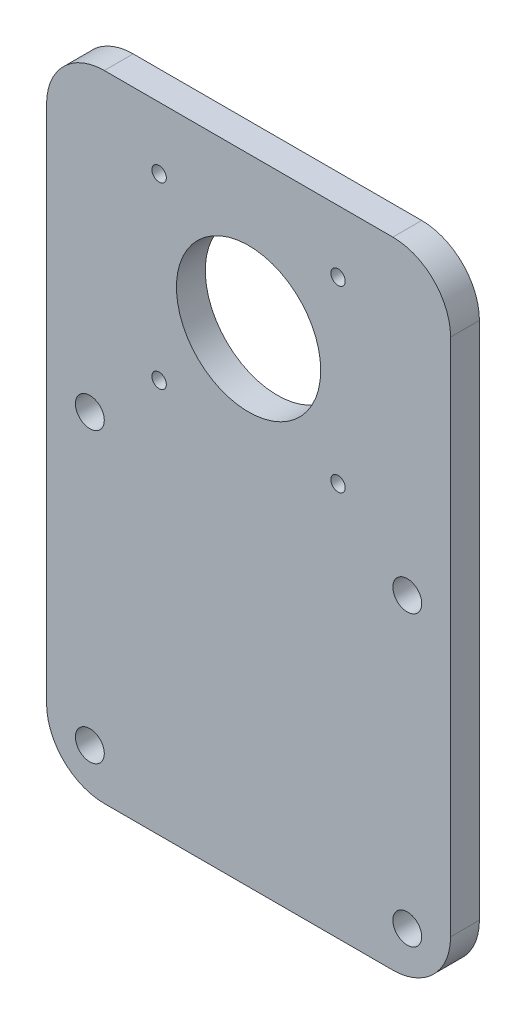
ISO-10303-21;
HEADER;
FILE_DESCRIPTION(('STEP AP214'),'2;1');
FILE_NAME('part.step','',(''),(''),'','','');
FILE_SCHEMA(('AUTOMOTIVE_DESIGN { 1 0 10303 214 1 1 1 1 }'));
ENDSEC;
DATA;
#1=APPLICATION_CONTEXT('core data for automotive mechanical design processes');
#2=APPLICATION_PROTOCOL_DEFINITION('international standard','automotive_design',2000,#1);
#3=PRODUCT_CONTEXT('',#1,'mechanical');
#4=PRODUCT('Part','Part','',(#3));
#5=PRODUCT_RELATED_PRODUCT_CATEGORY('part','',(#4));
#6=PRODUCT_DEFINITION_FORMATION('','',#4);
#7=PRODUCT_DEFINITION_CONTEXT('part definition',#1,'design');
#8=PRODUCT_DEFINITION('design','',#6,#7);
#9=PRODUCT_DEFINITION_SHAPE('','',#8);
#10=(LENGTH_UNIT() NAMED_UNIT(*) SI_UNIT(.MILLI.,.METRE.));
#11=(NAMED_UNIT(*) PLANE_ANGLE_UNIT() SI_UNIT($,.RADIAN.));
#12=(NAMED_UNIT(*) SI_UNIT($,.STERADIAN.) SOLID_ANGLE_UNIT());
#13=UNCERTAINTY_MEASURE_WITH_UNIT(LENGTH_MEASURE(1.E-05),#10,'distance_accuracy_value','');
#14=(GEOMETRIC_REPRESENTATION_CONTEXT(3) GLOBAL_UNCERTAINTY_ASSIGNED_CONTEXT((#13)) GLOBAL_UNIT_ASSIGNED_CONTEXT((#10,
#11,#12)) REPRESENTATION_CONTEXT('',''));
#15=CARTESIAN_POINT('',(0.,0.,0.));
#16=DIRECTION('',(0.,0.,1.));
#17=DIRECTION('',(1.,0.,0.));
#18=AXIS2_PLACEMENT_3D('',#15,#16,#17);
#19=CARTESIAN_POINT('',(0.,0.,5.));
#20=DIRECTION('',(0.,0.,1.));
#21=DIRECTION('',(1.,0.,0.));
#22=AXIS2_PLACEMENT_3D('',#19,#20,#21);
#23=PLANE('',#22);
#24=CARTESIAN_POINT('',(-5.50752462852537,-9.09687212660662,5.));
#25=DIRECTION('',(0.,0.,1.));
#26=DIRECTION('',(1.,0.,0.));
#27=AXIS2_PLACEMENT_3D('',#24,#25,#26);
#28=CIRCLE('',#27,1.25);
#29=CARTESIAN_POINT('',(-4.25752462852537,-9.09687212660662,5.));
#30=VERTEX_POINT('',#29);
#31=EDGE_CURVE('E247',#30,#30,#28,.T.);
#32=ORIENTED_EDGE('',*,*,#31,.F.);
#33=EDGE_LOOP('',(#32));
#34=FACE_BOUND('',#33,.T.);
#35=CARTESIAN_POINT('',(-36.5075246285254,21.9085783709457,5.));
#36=DIRECTION('',(0.,0.,1.));
#37=DIRECTION('',(1.,0.,0.));
#38=AXIS2_PLACEMENT_3D('',#35,#36,#37);
#39=CIRCLE('',#38,1.25);
#40=CARTESIAN_POINT('',(-35.2575246285254,21.9085783709457,5.));
#41=VERTEX_POINT('',#40);
#42=EDGE_CURVE('E231',#41,#41,#39,.T.);
#43=ORIENTED_EDGE('',*,*,#42,.F.);
#44=EDGE_LOOP('',(#43));
#45=FACE_BOUND('',#44,.T.);
#46=CARTESIAN_POINT('',(6.49247537147465,-69.8441468778305,5.));
#47=DIRECTION('',(0.,0.,1.));
#48=DIRECTION('',(1.,0.,0.));
#49=AXIS2_PLACEMENT_3D('',#46,#47,#48);
#50=CIRCLE('',#49,2.5);
#51=CARTESIAN_POINT('',(8.99247537147465,-69.8441468778305,5.));
#52=VERTEX_POINT('',#51);
#53=EDGE_CURVE('E215',#52,#52,#50,.T.);
#54=ORIENTED_EDGE('',*,*,#53,.F.);
#55=EDGE_LOOP('',(#54));
#56=FACE_BOUND('',#55,.T.);
#57=CARTESIAN_POINT('',(6.49247537147464,-19.8441468778305,5.));
#58=DIRECTION('',(0.,0.,1.));
#59=DIRECTION('',(1.,0.,0.));
#60=AXIS2_PLACEMENT_3D('',#57,#58,#59);
#61=CIRCLE('',#60,2.5);
#62=CARTESIAN_POINT('',(8.99247537147464,-19.8441468778305,5.));
#63=VERTEX_POINT('',#62);
#64=EDGE_CURVE('E199',#63,#63,#61,.T.);
#65=ORIENTED_EDGE('',*,*,#64,.F.);
#66=EDGE_LOOP('',(#65));
#67=FACE_BOUND('',#66,.T.);
#68=DIRECTION('',(0.,-1.,0.));
#69=VECTOR('',#68,1.);
#70=CARTESIAN_POINT('',(-56.0075246285254,32.6558531221695,5.));
#71=LINE('',#70,#69);
#72=CARTESIAN_POINT('',(-56.0075246285254,22.6558531221695,5.));
#73=VERTEX_POINT('',#72);
#74=CARTESIAN_POINT('',(-56.0075246285254,-67.3441468778305,5.));
#75=VERTEX_POINT('',#74);
#76=EDGE_CURVE('E150',#73,#75,#71,.T.);
#77=ORIENTED_EDGE('',*,*,#76,.T.);
#78=CARTESIAN_POINT('',(-46.0075246285254,-67.3441468778305,5.));
#79=DIRECTION('',(0.,0.,1.));
#80=DIRECTION('',(1.,0.,0.));
#81=AXIS2_PLACEMENT_3D('',#78,#79,#80);
#82=CIRCLE('',#81,10.);
#83=CARTESIAN_POINT('',(-46.0075246285254,-77.3441468778305,5.));
#84=VERTEX_POINT('',#83);
#85=EDGE_CURVE('E174',#75,#84,#82,.T.);
#86=ORIENTED_EDGE('',*,*,#85,.T.);
#87=DIRECTION('',(1.,0.,0.));
#88=VECTOR('',#87,1.);
#89=CARTESIAN_POINT('',(-56.0075246285254,-77.3441468778305,5.));
#90=LINE('',#89,#88);
#91=CARTESIAN_POINT('',(3.99247537147465,-77.3441468778305,5.));
#92=VERTEX_POINT('',#91);
#93=EDGE_CURVE('E127',#84,#92,#90,.T.);
#94=ORIENTED_EDGE('',*,*,#93,.T.);
#95=CARTESIAN_POINT('',(3.99247537147465,-67.3441468778305,5.));
#96=DIRECTION('',(0.,0.,1.));
#97=DIRECTION('',(1.,0.,0.));
#98=AXIS2_PLACEMENT_3D('',#95,#96,#97);
#99=CIRCLE('',#98,10.);
#100=CARTESIAN_POINT('',(13.9924753714746,-67.3441468778305,5.));
#101=VERTEX_POINT('',#100);
#102=EDGE_CURVE('E171',#92,#101,#99,.T.);
#103=ORIENTED_EDGE('',*,*,#102,.T.);
#104=DIRECTION('',(0.,1.,0.));
#105=VECTOR('',#104,1.);
#106=CARTESIAN_POINT('',(13.9924753714746,32.6558531221695,5.));
#107=LINE('',#106,#105);
#108=CARTESIAN_POINT('',(13.9924753714746,22.6558531221695,5.));
#109=VERTEX_POINT('',#108);
#110=EDGE_CURVE('E186',#101,#109,#107,.T.);
#111=ORIENTED_EDGE('',*,*,#110,.T.);
#112=CARTESIAN_POINT('',(3.99247537147463,22.6558531221695,5.));
#113=DIRECTION('',(0.,0.,1.));
#114=DIRECTION('',(1.,0.,0.));
#115=AXIS2_PLACEMENT_3D('',#112,#113,#114);
#116=CIRCLE('',#115,10.);
#117=CARTESIAN_POINT('',(3.99247537147463,32.6558531221695,5.));
#118=VERTEX_POINT('',#117);
#119=EDGE_CURVE('E61',#109,#118,#116,.T.);
#120=ORIENTED_EDGE('',*,*,#119,.T.);
#121=DIRECTION('',(-1.,0.,0.));
#122=VECTOR('',#121,1.);
#123=CARTESIAN_POINT('',(-56.0075246285254,32.6558531221695,5.));
#124=LINE('',#123,#122);
#125=CARTESIAN_POINT('',(-46.0075246285254,32.6558531221695,5.));
#126=VERTEX_POINT('',#125);
#127=EDGE_CURVE('E152',#118,#126,#124,.T.);
#128=ORIENTED_EDGE('',*,*,#127,.T.);
#129=CARTESIAN_POINT('',(-46.0075246285254,22.6558531221695,5.));
#130=DIRECTION('',(0.,0.,1.));
#131=DIRECTION('',(1.,0.,0.));
#132=AXIS2_PLACEMENT_3D('',#129,#130,#131);
#133=CIRCLE('',#132,10.);
#134=EDGE_CURVE('E166',#126,#73,#133,.T.);
#135=ORIENTED_EDGE('',*,*,#134,.T.);
#136=EDGE_LOOP('',(#77,#86,#94,#103,#111,#120,#128,#135));
#137=FACE_BOUND('',#136,.T.);
#138=CARTESIAN_POINT('',(-48.5075246285254,-19.8441468778305,5.));
#139=DIRECTION('',(0.,0.,1.));
#140=DIRECTION('',(1.,0.,0.));
#141=AXIS2_PLACEMENT_3D('',#138,#139,#140);
#142=CIRCLE('',#141,2.5);
#143=CARTESIAN_POINT('',(-46.0075246285254,-19.8441468778305,5.));
#144=VERTEX_POINT('',#143);
#145=EDGE_CURVE('E144',#144,#144,#142,.T.);
#146=ORIENTED_EDGE('',*,*,#145,.F.);
#147=EDGE_LOOP('',(#146));
#148=FACE_BOUND('',#147,.T.);
#149=CARTESIAN_POINT('',(-48.5075246285254,-69.8441468778305,5.));
#150=DIRECTION('',(0.,0.,1.));
#151=DIRECTION('',(1.,0.,0.));
#152=AXIS2_PLACEMENT_3D('',#149,#150,#151);
#153=CIRCLE('',#152,2.5);
#154=CARTESIAN_POINT('',(-46.0075246285254,-69.8441468778305,5.));
#155=VERTEX_POINT('',#154);
#156=EDGE_CURVE('E207',#155,#155,#153,.T.);
#157=ORIENTED_EDGE('',*,*,#156,.F.);
#158=EDGE_LOOP('',(#157));
#159=FACE_BOUND('',#158,.T.);
#160=CARTESIAN_POINT('',(-21.0075246285254,6.40585312216952,5.));
#161=DIRECTION('',(0.,0.,1.));
#162=DIRECTION('',(1.,0.,0.));
#163=AXIS2_PLACEMENT_3D('',#160,#161,#162);
#164=CIRCLE('',#163,12.5);
#165=CARTESIAN_POINT('',(-8.50752462852537,6.40585312216952,5.));
#166=VERTEX_POINT('',#165);
#167=EDGE_CURVE('E223',#166,#166,#164,.T.);
#168=ORIENTED_EDGE('',*,*,#167,.F.);
#169=EDGE_LOOP('',(#168));
#170=FACE_BOUND('',#169,.T.);
#171=CARTESIAN_POINT('',(-5.50752462852537,21.9031283524692,5.));
#172=DIRECTION('',(0.,0.,1.));
#173=DIRECTION('',(1.,0.,0.));
#174=AXIS2_PLACEMENT_3D('',#171,#172,#173);
#175=CIRCLE('',#174,1.25);
#176=CARTESIAN_POINT('',(-4.25752462852537,21.9031283524692,5.));
#177=VERTEX_POINT('',#176);
#178=EDGE_CURVE('E239',#177,#177,#175,.T.);
#179=ORIENTED_EDGE('',*,*,#178,.F.);
#180=EDGE_LOOP('',(#179));
#181=FACE_BOUND('',#180,.T.);
#182=CARTESIAN_POINT('',(-36.5075246285254,-9.09142210813016,5.));
#183=DIRECTION('',(0.,0.,1.));
#184=DIRECTION('',(1.,0.,0.));
#185=AXIS2_PLACEMENT_3D('',#182,#183,#184);
#186=CIRCLE('',#185,1.25);
#187=CARTESIAN_POINT('',(-35.2575246285254,-9.09142210813016,5.));
#188=VERTEX_POINT('',#187);
#189=EDGE_CURVE('E255',#188,#188,#186,.T.);
#190=ORIENTED_EDGE('',*,*,#189,.F.);
#191=EDGE_LOOP('',(#190));
#192=FACE_BOUND('',#191,.T.);
#193=ADVANCED_FACE('F39',(#34,#45,#56,#67,#137,#148,#159,#170,#181,#192),#23,.T.);
#194=CARTESIAN_POINT('',(0.,0.,0.));
#195=DIRECTION('',(0.,0.,1.));
#196=DIRECTION('',(1.,0.,0.));
#197=AXIS2_PLACEMENT_3D('',#194,#195,#196);
#198=PLANE('',#197);
#199=DIRECTION('',(1.,0.,0.));
#200=VECTOR('',#199,1.);
#201=CARTESIAN_POINT('',(-56.0075246285254,-77.3441468778305,0.));
#202=LINE('',#201,#200);
#203=CARTESIAN_POINT('',(-46.0075246285254,-77.3441468778305,0.));
#204=VERTEX_POINT('',#203);
#205=CARTESIAN_POINT('',(3.99247537147465,-77.3441468778305,0.));
#206=VERTEX_POINT('',#205);
#207=EDGE_CURVE('E124',#204,#206,#202,.T.);
#208=ORIENTED_EDGE('',*,*,#207,.F.);
#209=CARTESIAN_POINT('',(-46.0075246285254,-67.3441468778305,0.));
#210=DIRECTION('',(0.,0.,1.));
#211=DIRECTION('',(1.,0.,0.));
#212=AXIS2_PLACEMENT_3D('',#209,#210,#211);
#213=CIRCLE('',#212,10.);
#214=CARTESIAN_POINT('',(-56.0075246285254,-67.3441468778305,0.));
#215=VERTEX_POINT('',#214);
#216=EDGE_CURVE('E106',#204,#215,#213,.F.);
#217=ORIENTED_EDGE('',*,*,#216,.T.);
#218=DIRECTION('',(0.,-1.,0.));
#219=VECTOR('',#218,1.);
#220=CARTESIAN_POINT('',(-56.0075246285254,32.6558531221695,0.));
#221=LINE('',#220,#219);
#222=CARTESIAN_POINT('',(-56.0075246285254,22.6558531221695,0.));
#223=VERTEX_POINT('',#222);
#224=EDGE_CURVE('E137',#223,#215,#221,.T.);
#225=ORIENTED_EDGE('',*,*,#224,.F.);
#226=CARTESIAN_POINT('',(-46.0075246285254,22.6558531221695,0.));
#227=DIRECTION('',(0.,0.,1.));
#228=DIRECTION('',(1.,0.,0.));
#229=AXIS2_PLACEMENT_3D('',#226,#227,#228);
#230=CIRCLE('',#229,10.);
#231=CARTESIAN_POINT('',(-46.0075246285254,32.6558531221695,0.));
#232=VERTEX_POINT('',#231);
#233=EDGE_CURVE('E129',#223,#232,#230,.F.);
#234=ORIENTED_EDGE('',*,*,#233,.T.);
#235=DIRECTION('',(-1.,0.,0.));
#236=VECTOR('',#235,1.);
#237=CARTESIAN_POINT('',(-56.0075246285254,32.6558531221695,0.));
#238=LINE('',#237,#236);
#239=CARTESIAN_POINT('',(3.99247537147463,32.6558531221695,0.));
#240=VERTEX_POINT('',#239);
#241=EDGE_CURVE('E142',#240,#232,#238,.T.);
#242=ORIENTED_EDGE('',*,*,#241,.F.);
#243=CARTESIAN_POINT('',(3.99247537147463,22.6558531221695,0.));
#244=DIRECTION('',(0.,0.,1.));
#245=DIRECTION('',(1.,0.,0.));
#246=AXIS2_PLACEMENT_3D('',#243,#244,#245);
#247=CIRCLE('',#246,10.);
#248=CARTESIAN_POINT('',(13.9924753714746,22.6558531221695,0.));
#249=VERTEX_POINT('',#248);
#250=EDGE_CURVE('E156',#240,#249,#247,.F.);
#251=ORIENTED_EDGE('',*,*,#250,.T.);
#252=DIRECTION('',(0.,1.,0.));
#253=VECTOR('',#252,1.);
#254=CARTESIAN_POINT('',(13.9924753714746,32.6558531221695,0.));
#255=LINE('',#254,#253);
#256=CARTESIAN_POINT('',(13.9924753714746,-67.3441468778305,0.));
#257=VERTEX_POINT('',#256);
#258=EDGE_CURVE('E136',#257,#249,#255,.T.);
#259=ORIENTED_EDGE('',*,*,#258,.F.);
#260=CARTESIAN_POINT('',(3.99247537147465,-67.3441468778305,0.));
#261=DIRECTION('',(0.,0.,1.));
#262=DIRECTION('',(1.,0.,0.));
#263=AXIS2_PLACEMENT_3D('',#260,#261,#262);
#264=CIRCLE('',#263,10.);
#265=EDGE_CURVE('E118',#257,#206,#264,.F.);
#266=ORIENTED_EDGE('',*,*,#265,.T.);
#267=EDGE_LOOP('',(#208,#217,#225,#234,#242,#251,#259,#266));
#268=FACE_BOUND('',#267,.T.);
#269=CARTESIAN_POINT('',(-48.5075246285254,-19.8441468778305,0.));
#270=DIRECTION('',(0.,0.,1.));
#271=DIRECTION('',(1.,0.,0.));
#272=AXIS2_PLACEMENT_3D('',#269,#270,#271);
#273=CIRCLE('',#272,2.5);
#274=CARTESIAN_POINT('',(-46.0075246285254,-19.8441468778305,0.));
#275=VERTEX_POINT('',#274);
#276=EDGE_CURVE('E195',#275,#275,#273,.T.);
#277=ORIENTED_EDGE('',*,*,#276,.T.);
#278=EDGE_LOOP('',(#277));
#279=FACE_BOUND('',#278,.T.);
#280=CARTESIAN_POINT('',(6.49247537147464,-19.8441468778305,0.));
#281=DIRECTION('',(0.,0.,1.));
#282=DIRECTION('',(1.,0.,0.));
#283=AXIS2_PLACEMENT_3D('',#280,#281,#282);
#284=CIRCLE('',#283,2.5);
#285=CARTESIAN_POINT('',(8.99247537147464,-19.8441468778305,0.));
#286=VERTEX_POINT('',#285);
#287=EDGE_CURVE('E203',#286,#286,#284,.T.);
#288=ORIENTED_EDGE('',*,*,#287,.T.);
#289=EDGE_LOOP('',(#288));
#290=FACE_BOUND('',#289,.T.);
#291=CARTESIAN_POINT('',(-48.5075246285254,-69.8441468778305,0.));
#292=DIRECTION('',(0.,0.,1.));
#293=DIRECTION('',(1.,0.,0.));
#294=AXIS2_PLACEMENT_3D('',#291,#292,#293);
#295=CIRCLE('',#294,2.5);
#296=CARTESIAN_POINT('',(-46.0075246285254,-69.8441468778305,0.));
#297=VERTEX_POINT('',#296);
#298=EDGE_CURVE('E211',#297,#297,#295,.T.);
#299=ORIENTED_EDGE('',*,*,#298,.T.);
#300=EDGE_LOOP('',(#299));
#301=FACE_BOUND('',#300,.T.);
#302=CARTESIAN_POINT('',(6.49247537147465,-69.8441468778305,0.));
#303=DIRECTION('',(0.,0.,1.));
#304=DIRECTION('',(1.,0.,0.));
#305=AXIS2_PLACEMENT_3D('',#302,#303,#304);
#306=CIRCLE('',#305,2.5);
#307=CARTESIAN_POINT('',(8.99247537147465,-69.8441468778305,0.));
#308=VERTEX_POINT('',#307);
#309=EDGE_CURVE('E219',#308,#308,#306,.T.);
#310=ORIENTED_EDGE('',*,*,#309,.T.);
#311=EDGE_LOOP('',(#310));
#312=FACE_BOUND('',#311,.T.);
#313=CARTESIAN_POINT('',(-21.0075246285254,6.40585312216952,0.));
#314=DIRECTION('',(0.,0.,1.));
#315=DIRECTION('',(1.,0.,0.));
#316=AXIS2_PLACEMENT_3D('',#313,#314,#315);
#317=CIRCLE('',#316,12.5);
#318=CARTESIAN_POINT('',(-8.50752462852537,6.40585312216952,0.));
#319=VERTEX_POINT('',#318);
#320=EDGE_CURVE('E227',#319,#319,#317,.T.);
#321=ORIENTED_EDGE('',*,*,#320,.T.);
#322=EDGE_LOOP('',(#321));
#323=FACE_BOUND('',#322,.T.);
#324=CARTESIAN_POINT('',(-36.5075246285254,21.9085783709457,0.));
#325=DIRECTION('',(0.,0.,1.));
#326=DIRECTION('',(1.,0.,0.));
#327=AXIS2_PLACEMENT_3D('',#324,#325,#326);
#328=CIRCLE('',#327,1.25);
#329=CARTESIAN_POINT('',(-35.2575246285254,21.9085783709457,0.));
#330=VERTEX_POINT('',#329);
#331=EDGE_CURVE('E235',#330,#330,#328,.T.);
#332=ORIENTED_EDGE('',*,*,#331,.T.);
#333=EDGE_LOOP('',(#332));
#334=FACE_BOUND('',#333,.T.);
#335=CARTESIAN_POINT('',(-5.50752462852537,21.9031283524692,0.));
#336=DIRECTION('',(0.,0.,1.));
#337=DIRECTION('',(1.,0.,0.));
#338=AXIS2_PLACEMENT_3D('',#335,#336,#337);
#339=CIRCLE('',#338,1.25);
#340=CARTESIAN_POINT('',(-4.25752462852537,21.9031283524692,0.));
#341=VERTEX_POINT('',#340);
#342=EDGE_CURVE('E243',#341,#341,#339,.T.);
#343=ORIENTED_EDGE('',*,*,#342,.T.);
#344=EDGE_LOOP('',(#343));
#345=FACE_BOUND('',#344,.T.);
#346=CARTESIAN_POINT('',(-5.50752462852537,-9.09687212660662,0.));
#347=DIRECTION('',(0.,0.,1.));
#348=DIRECTION('',(1.,0.,0.));
#349=AXIS2_PLACEMENT_3D('',#346,#347,#348);
#350=CIRCLE('',#349,1.25);
#351=CARTESIAN_POINT('',(-4.25752462852537,-9.09687212660662,0.));
#352=VERTEX_POINT('',#351);
#353=EDGE_CURVE('E251',#352,#352,#350,.T.);
#354=ORIENTED_EDGE('',*,*,#353,.T.);
#355=EDGE_LOOP('',(#354));
#356=FACE_BOUND('',#355,.T.);
#357=CARTESIAN_POINT('',(-36.5075246285254,-9.09142210813016,0.));
#358=DIRECTION('',(0.,0.,1.));
#359=DIRECTION('',(1.,0.,0.));
#360=AXIS2_PLACEMENT_3D('',#357,#358,#359);
#361=CIRCLE('',#360,1.25);
#362=CARTESIAN_POINT('',(-35.2575246285254,-9.09142210813016,0.));
#363=VERTEX_POINT('',#362);
#364=EDGE_CURVE('E259',#363,#363,#361,.T.);
#365=ORIENTED_EDGE('',*,*,#364,.T.);
#366=EDGE_LOOP('',(#365));
#367=FACE_BOUND('',#366,.T.);
#368=ADVANCED_FACE('F132',(#268,#279,#290,#301,#312,#323,#334,#345,#356,#367),#198,.F.);
#369=CARTESIAN_POINT('',(-56.0075246285254,32.6558531221695,5.));
#370=DIRECTION('',(1.,0.,0.));
#371=DIRECTION('',(0.,1.,0.));
#372=AXIS2_PLACEMENT_3D('',#369,#370,#371);
#373=PLANE('',#372);
#374=ORIENTED_EDGE('',*,*,#224,.T.);
#375=DIRECTION('',(0.,0.,-1.));
#376=VECTOR('',#375,1.);
#377=CARTESIAN_POINT('',(-56.0075246285254,-67.3441468778305,5.));
#378=LINE('',#377,#376);
#379=EDGE_CURVE('E111',#215,#75,#378,.F.);
#380=ORIENTED_EDGE('',*,*,#379,.T.);
#381=ORIENTED_EDGE('',*,*,#76,.F.);
#382=DIRECTION('',(0.,0.,-1.));
#383=VECTOR('',#382,1.);
#384=CARTESIAN_POINT('',(-56.0075246285254,22.6558531221695,5.));
#385=LINE('',#384,#383);
#386=EDGE_CURVE('E117',#73,#223,#385,.T.);
#387=ORIENTED_EDGE('',*,*,#386,.T.);
#388=EDGE_LOOP('',(#374,#380,#381,#387));
#389=FACE_BOUND('',#388,.T.);
#390=ADVANCED_FACE('F276',(#389),#373,.F.);
#391=CARTESIAN_POINT('',(-56.0075246285254,-77.3441468778305,5.));
#392=DIRECTION('',(0.,1.,0.));
#393=DIRECTION('',(0.,0.,1.));
#394=AXIS2_PLACEMENT_3D('',#391,#392,#393);
#395=PLANE('',#394);
#396=ORIENTED_EDGE('',*,*,#93,.F.);
#397=DIRECTION('',(0.,0.,-1.));
#398=VECTOR('',#397,1.);
#399=CARTESIAN_POINT('',(-46.0075246285254,-77.3441468778305,5.));
#400=LINE('',#399,#398);
#401=EDGE_CURVE('E110',#84,#204,#400,.T.);
#402=ORIENTED_EDGE('',*,*,#401,.T.);
#403=ORIENTED_EDGE('',*,*,#207,.T.);
#404=DIRECTION('',(0.,0.,-1.));
#405=VECTOR('',#404,1.);
#406=CARTESIAN_POINT('',(3.99247537147465,-77.3441468778305,5.));
#407=LINE('',#406,#405);
#408=EDGE_CURVE('E130',#206,#92,#407,.F.);
#409=ORIENTED_EDGE('',*,*,#408,.T.);
#410=EDGE_LOOP('',(#396,#402,#403,#409));
#411=FACE_BOUND('',#410,.T.);
#412=ADVANCED_FACE('F123',(#411),#395,.F.);
#413=CARTESIAN_POINT('',(13.9924753714746,32.6558531221695,5.));
#414=DIRECTION('',(-1.,0.,0.));
#415=DIRECTION('',(0.,-1.,0.));
#416=AXIS2_PLACEMENT_3D('',#413,#414,#415);
#417=PLANE('',#416);
#418=ORIENTED_EDGE('',*,*,#110,.F.);
#419=DIRECTION('',(0.,0.,-1.));
#420=VECTOR('',#419,1.);
#421=CARTESIAN_POINT('',(13.9924753714746,-67.3441468778305,5.));
#422=LINE('',#421,#420);
#423=EDGE_CURVE('E180',#101,#257,#422,.T.);
#424=ORIENTED_EDGE('',*,*,#423,.T.);
#425=ORIENTED_EDGE('',*,*,#258,.T.);
#426=DIRECTION('',(0.,0.,-1.));
#427=VECTOR('',#426,1.);
#428=CARTESIAN_POINT('',(13.9924753714746,22.6558531221695,5.));
#429=LINE('',#428,#427);
#430=EDGE_CURVE('E177',#249,#109,#429,.F.);
#431=ORIENTED_EDGE('',*,*,#430,.T.);
#432=EDGE_LOOP('',(#418,#424,#425,#431));
#433=FACE_BOUND('',#432,.T.);
#434=ADVANCED_FACE('F287',(#433),#417,.F.);
#435=CARTESIAN_POINT('',(-56.0075246285254,32.6558531221695,5.));
#436=DIRECTION('',(0.,-1.,0.));
#437=DIRECTION('',(0.,0.,-1.));
#438=AXIS2_PLACEMENT_3D('',#435,#436,#437);
#439=PLANE('',#438);
#440=ORIENTED_EDGE('',*,*,#127,.F.);
#441=DIRECTION('',(0.,0.,-1.));
#442=VECTOR('',#441,1.);
#443=CARTESIAN_POINT('',(3.99247537147463,32.6558531221695,5.));
#444=LINE('',#443,#442);
#445=EDGE_CURVE('E11',#118,#240,#444,.T.);
#446=ORIENTED_EDGE('',*,*,#445,.T.);
#447=ORIENTED_EDGE('',*,*,#241,.T.);
#448=DIRECTION('',(0.,0.,-1.));
#449=VECTOR('',#448,1.);
#450=CARTESIAN_POINT('',(-46.0075246285254,32.6558531221695,5.));
#451=LINE('',#450,#449);
#452=EDGE_CURVE('E48',#232,#126,#451,.F.);
#453=ORIENTED_EDGE('',*,*,#452,.T.);
#454=EDGE_LOOP('',(#440,#446,#447,#453));
#455=FACE_BOUND('',#454,.T.);
#456=ADVANCED_FACE('F284',(#455),#439,.F.);
#457=CARTESIAN_POINT('',(-48.5075246285254,-19.8441468778305,5.));
#458=DIRECTION('',(0.,0.,-1.));
#459=DIRECTION('',(-1.,0.,0.));
#460=AXIS2_PLACEMENT_3D('',#457,#458,#459);
#461=CYLINDRICAL_SURFACE('',#460,2.5);
#462=ORIENTED_EDGE('',*,*,#145,.T.);
#463=EDGE_LOOP('',(#462));
#464=FACE_BOUND('',#463,.T.);
#465=ORIENTED_EDGE('',*,*,#276,.F.);
#466=EDGE_LOOP('',(#465));
#467=FACE_BOUND('',#466,.T.);
#468=ADVANCED_FACE('F281',(#464,#467),#461,.F.);
#469=CARTESIAN_POINT('',(6.49247537147464,-19.8441468778305,5.));
#470=DIRECTION('',(0.,0.,-1.));
#471=DIRECTION('',(-1.,0.,0.));
#472=AXIS2_PLACEMENT_3D('',#469,#470,#471);
#473=CYLINDRICAL_SURFACE('',#472,2.5);
#474=ORIENTED_EDGE('',*,*,#64,.T.);
#475=EDGE_LOOP('',(#474));
#476=FACE_BOUND('',#475,.T.);
#477=ORIENTED_EDGE('',*,*,#287,.F.);
#478=EDGE_LOOP('',(#477));
#479=FACE_BOUND('',#478,.T.);
#480=ADVANCED_FACE('F355',(#476,#479),#473,.F.);
#481=CARTESIAN_POINT('',(-48.5075246285254,-69.8441468778305,5.));
#482=DIRECTION('',(0.,0.,-1.));
#483=DIRECTION('',(-1.,0.,0.));
#484=AXIS2_PLACEMENT_3D('',#481,#482,#483);
#485=CYLINDRICAL_SURFACE('',#484,2.5);
#486=ORIENTED_EDGE('',*,*,#156,.T.);
#487=EDGE_LOOP('',(#486));
#488=FACE_BOUND('',#487,.T.);
#489=ORIENTED_EDGE('',*,*,#298,.F.);
#490=EDGE_LOOP('',(#489));
#491=FACE_BOUND('',#490,.T.);
#492=ADVANCED_FACE('F352',(#488,#491),#485,.F.);
#493=CARTESIAN_POINT('',(6.49247537147465,-69.8441468778305,5.));
#494=DIRECTION('',(0.,0.,-1.));
#495=DIRECTION('',(-1.,0.,0.));
#496=AXIS2_PLACEMENT_3D('',#493,#494,#495);
#497=CYLINDRICAL_SURFACE('',#496,2.5);
#498=ORIENTED_EDGE('',*,*,#53,.T.);
#499=EDGE_LOOP('',(#498));
#500=FACE_BOUND('',#499,.T.);
#501=ORIENTED_EDGE('',*,*,#309,.F.);
#502=EDGE_LOOP('',(#501));
#503=FACE_BOUND('',#502,.T.);
#504=ADVANCED_FACE('F348',(#500,#503),#497,.F.);
#505=CARTESIAN_POINT('',(-21.0075246285254,6.40585312216952,5.));
#506=DIRECTION('',(0.,0.,-1.));
#507=DIRECTION('',(-1.,0.,0.));
#508=AXIS2_PLACEMENT_3D('',#505,#506,#507);
#509=CYLINDRICAL_SURFACE('',#508,12.5);
#510=ORIENTED_EDGE('',*,*,#167,.T.);
#511=EDGE_LOOP('',(#510));
#512=FACE_BOUND('',#511,.T.);
#513=ORIENTED_EDGE('',*,*,#320,.F.);
#514=EDGE_LOOP('',(#513));
#515=FACE_BOUND('',#514,.T.);
#516=ADVANCED_FACE('F344',(#512,#515),#509,.F.);
#517=CARTESIAN_POINT('',(-36.5075246285254,21.9085783709457,5.));
#518=DIRECTION('',(0.,0.,-1.));
#519=DIRECTION('',(-1.,0.,0.));
#520=AXIS2_PLACEMENT_3D('',#517,#518,#519);
#521=CYLINDRICAL_SURFACE('',#520,1.25);
#522=ORIENTED_EDGE('',*,*,#42,.T.);
#523=EDGE_LOOP('',(#522));
#524=FACE_BOUND('',#523,.T.);
#525=ORIENTED_EDGE('',*,*,#331,.F.);
#526=EDGE_LOOP('',(#525));
#527=FACE_BOUND('',#526,.T.);
#528=ADVANCED_FACE('F326',(#524,#527),#521,.F.);
#529=CARTESIAN_POINT('',(-5.50752462852537,21.9031283524692,5.));
#530=DIRECTION('',(0.,0.,-1.));
#531=DIRECTION('',(-1.,0.,0.));
#532=AXIS2_PLACEMENT_3D('',#529,#530,#531);
#533=CYLINDRICAL_SURFACE('',#532,1.25);
#534=ORIENTED_EDGE('',*,*,#178,.T.);
#535=EDGE_LOOP('',(#534));
#536=FACE_BOUND('',#535,.T.);
#537=ORIENTED_EDGE('',*,*,#342,.F.);
#538=EDGE_LOOP('',(#537));
#539=FACE_BOUND('',#538,.T.);
#540=ADVANCED_FACE('F322',(#536,#539),#533,.F.);
#541=CARTESIAN_POINT('',(-5.50752462852537,-9.09687212660662,5.));
#542=DIRECTION('',(0.,0.,-1.));
#543=DIRECTION('',(-1.,0.,0.));
#544=AXIS2_PLACEMENT_3D('',#541,#542,#543);
#545=CYLINDRICAL_SURFACE('',#544,1.25);
#546=ORIENTED_EDGE('',*,*,#31,.T.);
#547=EDGE_LOOP('',(#546));
#548=FACE_BOUND('',#547,.T.);
#549=ORIENTED_EDGE('',*,*,#353,.F.);
#550=EDGE_LOOP('',(#549));
#551=FACE_BOUND('',#550,.T.);
#552=ADVANCED_FACE('F325',(#548,#551),#545,.F.);
#553=CARTESIAN_POINT('',(-36.5075246285254,-9.09142210813016,5.));
#554=DIRECTION('',(0.,0.,-1.));
#555=DIRECTION('',(-1.,0.,0.));
#556=AXIS2_PLACEMENT_3D('',#553,#554,#555);
#557=CYLINDRICAL_SURFACE('',#556,1.25);
#558=ORIENTED_EDGE('',*,*,#189,.T.);
#559=EDGE_LOOP('',(#558));
#560=FACE_BOUND('',#559,.T.);
#561=ORIENTED_EDGE('',*,*,#364,.F.);
#562=EDGE_LOOP('',(#561));
#563=FACE_BOUND('',#562,.T.);
#564=ADVANCED_FACE('F267',(#560,#563),#557,.F.);
#565=CARTESIAN_POINT('',(-46.0075246285254,-67.3441468778305,5.));
#566=DIRECTION('',(0.,0.,-1.));
#567=DIRECTION('',(-1.,0.,0.));
#568=AXIS2_PLACEMENT_3D('',#565,#566,#567);
#569=CYLINDRICAL_SURFACE('',#568,10.);
#570=ORIENTED_EDGE('',*,*,#85,.F.);
#571=ORIENTED_EDGE('',*,*,#379,.F.);
#572=ORIENTED_EDGE('',*,*,#216,.F.);
#573=ORIENTED_EDGE('',*,*,#401,.F.);
#574=EDGE_LOOP('',(#570,#571,#572,#573));
#575=FACE_BOUND('',#574,.T.);
#576=ADVANCED_FACE('F109',(#575),#569,.T.);
#577=CARTESIAN_POINT('',(3.99247537147465,-67.3441468778305,5.));
#578=DIRECTION('',(0.,0.,-1.));
#579=DIRECTION('',(-1.,0.,0.));
#580=AXIS2_PLACEMENT_3D('',#577,#578,#579);
#581=CYLINDRICAL_SURFACE('',#580,10.);
#582=ORIENTED_EDGE('',*,*,#102,.F.);
#583=ORIENTED_EDGE('',*,*,#408,.F.);
#584=ORIENTED_EDGE('',*,*,#265,.F.);
#585=ORIENTED_EDGE('',*,*,#423,.F.);
#586=EDGE_LOOP('',(#582,#583,#584,#585));
#587=FACE_BOUND('',#586,.T.);
#588=ADVANCED_FACE('F298',(#587),#581,.T.);
#589=CARTESIAN_POINT('',(3.99247537147463,22.6558531221695,5.));
#590=DIRECTION('',(0.,0.,-1.));
#591=DIRECTION('',(-1.,0.,0.));
#592=AXIS2_PLACEMENT_3D('',#589,#590,#591);
#593=CYLINDRICAL_SURFACE('',#592,10.);
#594=ORIENTED_EDGE('',*,*,#119,.F.);
#595=ORIENTED_EDGE('',*,*,#430,.F.);
#596=ORIENTED_EDGE('',*,*,#250,.F.);
#597=ORIENTED_EDGE('',*,*,#445,.F.);
#598=EDGE_LOOP('',(#594,#595,#596,#597));
#599=FACE_BOUND('',#598,.T.);
#600=ADVANCED_FACE('F300',(#599),#593,.T.);
#601=CARTESIAN_POINT('',(-46.0075246285254,22.6558531221695,5.));
#602=DIRECTION('',(0.,0.,-1.));
#603=DIRECTION('',(-1.,0.,0.));
#604=AXIS2_PLACEMENT_3D('',#601,#602,#603);
#605=CYLINDRICAL_SURFACE('',#604,10.);
#606=ORIENTED_EDGE('',*,*,#134,.F.);
#607=ORIENTED_EDGE('',*,*,#452,.F.);
#608=ORIENTED_EDGE('',*,*,#233,.F.);
#609=ORIENTED_EDGE('',*,*,#386,.F.);
#610=EDGE_LOOP('',(#606,#607,#608,#609));
#611=FACE_BOUND('',#610,.T.);
#612=ADVANCED_FACE('F41',(#611),#605,.T.);
#613=CLOSED_SHELL('',(#193,#368,#390,#412,#434,#456,#468,#480,#492,#504,#516,#528,#540,#552,
#564,#576,#588,#600,#612));
#614=MANIFOLD_SOLID_BREP('B2',#613);
#615=ADVANCED_BREP_SHAPE_REPRESENTATION('',(#18,#614),#14);
#616=SHAPE_DEFINITION_REPRESENTATION(#9,#615);
ENDSEC;
END-ISO-10303-21;
